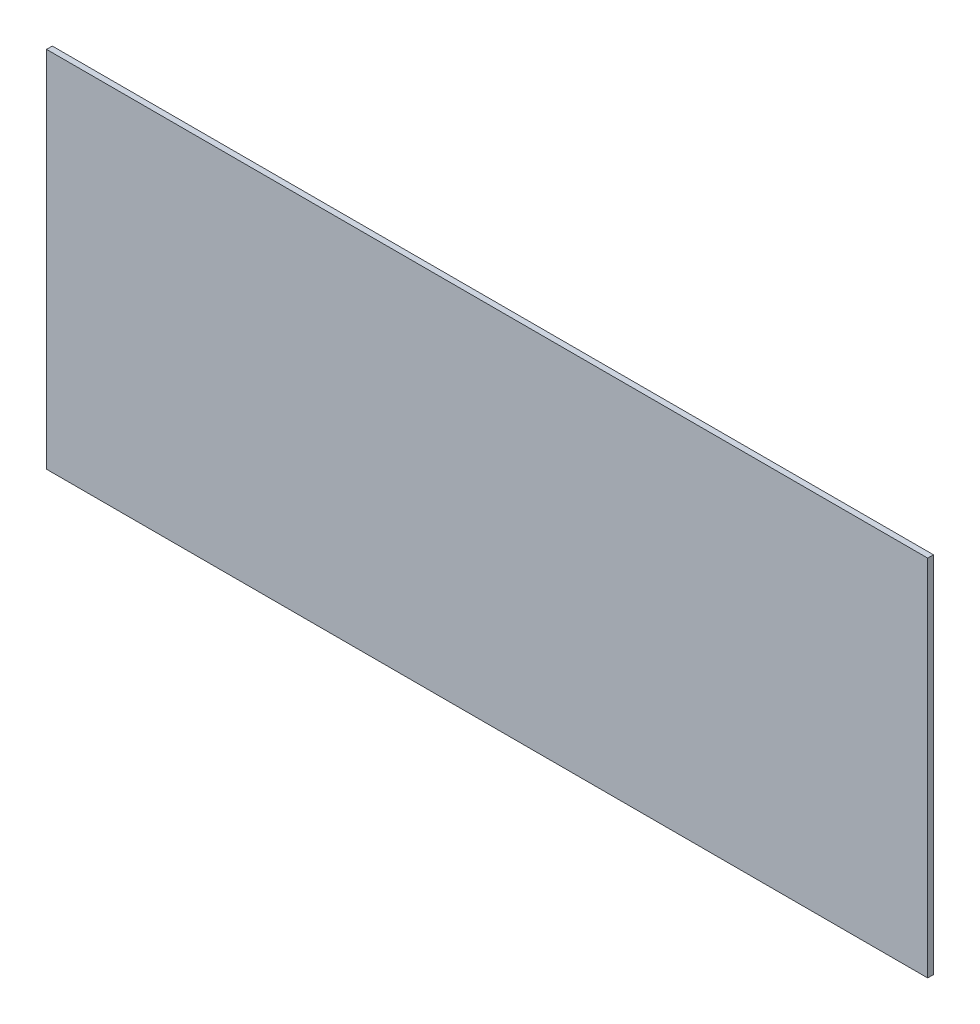
ISO-10303-21;
HEADER;
FILE_DESCRIPTION(('STEP AP214'),'2;1');
FILE_NAME('part.step','',(''),(''),'','','');
FILE_SCHEMA(('AUTOMOTIVE_DESIGN { 1 0 10303 214 1 1 1 1 }'));
ENDSEC;
DATA;
#1=APPLICATION_CONTEXT('core data for automotive mechanical design processes');
#2=APPLICATION_PROTOCOL_DEFINITION('international standard','automotive_design',2000,#1);
#3=PRODUCT_CONTEXT('',#1,'mechanical');
#4=PRODUCT('Part','Part','',(#3));
#5=PRODUCT_RELATED_PRODUCT_CATEGORY('part','',(#4));
#6=PRODUCT_DEFINITION_FORMATION('','',#4);
#7=PRODUCT_DEFINITION_CONTEXT('part definition',#1,'design');
#8=PRODUCT_DEFINITION('design','',#6,#7);
#9=PRODUCT_DEFINITION_SHAPE('','',#8);
#10=(LENGTH_UNIT() NAMED_UNIT(*) SI_UNIT(.MILLI.,.METRE.));
#11=(NAMED_UNIT(*) PLANE_ANGLE_UNIT() SI_UNIT($,.RADIAN.));
#12=(NAMED_UNIT(*) SI_UNIT($,.STERADIAN.) SOLID_ANGLE_UNIT());
#13=UNCERTAINTY_MEASURE_WITH_UNIT(LENGTH_MEASURE(1.E-05),#10,'distance_accuracy_value','');
#14=(GEOMETRIC_REPRESENTATION_CONTEXT(3) GLOBAL_UNCERTAINTY_ASSIGNED_CONTEXT((#13)) GLOBAL_UNIT_ASSIGNED_CONTEXT((#10,
#11,#12)) REPRESENTATION_CONTEXT('',''));
#15=CARTESIAN_POINT('',(0.,0.,0.));
#16=DIRECTION('',(0.,0.,1.));
#17=DIRECTION('',(1.,0.,0.));
#18=AXIS2_PLACEMENT_3D('',#15,#16,#17);
#19=CARTESIAN_POINT('',(-191.,-321.439024390244,2.));
#20=DIRECTION('',(-1.,0.,0.));
#21=DIRECTION('',(0.,0.,1.));
#22=AXIS2_PLACEMENT_3D('',#19,#20,#21);
#23=PLANE('',#22);
#24=DIRECTION('',(0.,1.,0.));
#25=VECTOR('',#24,1.);
#26=CARTESIAN_POINT('',(-191.,-321.439024390244,0.));
#27=LINE('',#26,#25);
#28=CARTESIAN_POINT('',(-191.,-321.439024390244,0.));
#29=VERTEX_POINT('',#28);
#30=CARTESIAN_POINT('',(-191.,-195.57921260815,0.));
#31=VERTEX_POINT('',#30);
#32=EDGE_CURVE('E69',#29,#31,#27,.T.);
#33=ORIENTED_EDGE('',*,*,#32,.F.);
#34=DIRECTION('',(0.,0.,-1.));
#35=VECTOR('',#34,1.);
#36=CARTESIAN_POINT('',(-191.,-321.439024390244,2.));
#37=LINE('',#36,#35);
#38=CARTESIAN_POINT('',(-191.,-321.439024390244,2.));
#39=VERTEX_POINT('',#38);
#40=EDGE_CURVE('E11',#39,#29,#37,.T.);
#41=ORIENTED_EDGE('',*,*,#40,.F.);
#42=DIRECTION('',(0.,1.,0.));
#43=VECTOR('',#42,1.);
#44=CARTESIAN_POINT('',(-191.,-321.439024390244,2.));
#45=LINE('',#44,#43);
#46=CARTESIAN_POINT('',(-191.,-195.57921260815,2.));
#47=VERTEX_POINT('',#46);
#48=EDGE_CURVE('E79',#39,#47,#45,.T.);
#49=ORIENTED_EDGE('',*,*,#48,.T.);
#50=DIRECTION('',(0.,0.,-1.));
#51=VECTOR('',#50,1.);
#52=CARTESIAN_POINT('',(-191.,-195.57921260815,0.));
#53=LINE('',#52,#51);
#54=EDGE_CURVE('E81',#47,#31,#53,.T.);
#55=ORIENTED_EDGE('',*,*,#54,.T.);
#56=EDGE_LOOP('',(#33,#41,#49,#55));
#57=FACE_BOUND('',#56,.T.);
#58=ADVANCED_FACE('F37',(#57),#23,.T.);
#59=CARTESIAN_POINT('',(114.,-321.439024390244,2.));
#60=DIRECTION('',(0.,-1.,0.));
#61=DIRECTION('',(0.,0.,-1.));
#62=AXIS2_PLACEMENT_3D('',#59,#60,#61);
#63=PLANE('',#62);
#64=DIRECTION('',(-1.,0.,0.));
#65=VECTOR('',#64,1.);
#66=CARTESIAN_POINT('',(114.,-321.439024390244,0.));
#67=LINE('',#66,#65);
#68=CARTESIAN_POINT('',(114.,-321.439024390244,0.));
#69=VERTEX_POINT('',#68);
#70=EDGE_CURVE('E107',#69,#29,#67,.T.);
#71=ORIENTED_EDGE('',*,*,#70,.F.);
#72=DIRECTION('',(0.,0.,-1.));
#73=VECTOR('',#72,1.);
#74=CARTESIAN_POINT('',(114.,-321.439024390244,2.));
#75=LINE('',#74,#73);
#76=CARTESIAN_POINT('',(114.,-321.439024390244,2.));
#77=VERTEX_POINT('',#76);
#78=EDGE_CURVE('E41',#77,#69,#75,.T.);
#79=ORIENTED_EDGE('',*,*,#78,.F.);
#80=DIRECTION('',(-1.,0.,0.));
#81=VECTOR('',#80,1.);
#82=CARTESIAN_POINT('',(114.,-321.439024390244,2.));
#83=LINE('',#82,#81);
#84=EDGE_CURVE('E85',#77,#39,#83,.T.);
#85=ORIENTED_EDGE('',*,*,#84,.T.);
#86=ORIENTED_EDGE('',*,*,#40,.T.);
#87=EDGE_LOOP('',(#71,#79,#85,#86));
#88=FACE_BOUND('',#87,.T.);
#89=ADVANCED_FACE('F111',(#88),#63,.T.);
#90=CARTESIAN_POINT('',(114.,-221.439024390244,2.));
#91=DIRECTION('',(1.,0.,0.));
#92=DIRECTION('',(0.,0.,-1.));
#93=AXIS2_PLACEMENT_3D('',#90,#91,#92);
#94=PLANE('',#93);
#95=DIRECTION('',(0.,-1.,0.));
#96=VECTOR('',#95,1.);
#97=CARTESIAN_POINT('',(114.,-221.439024390244,0.));
#98=LINE('',#97,#96);
#99=CARTESIAN_POINT('',(114.,-195.57921260815,0.));
#100=VERTEX_POINT('',#99);
#101=EDGE_CURVE('E104',#100,#69,#98,.T.);
#102=ORIENTED_EDGE('',*,*,#101,.F.);
#103=DIRECTION('',(0.,0.,1.));
#104=VECTOR('',#103,1.);
#105=CARTESIAN_POINT('',(114.,-195.57921260815,2.00000000000001));
#106=LINE('',#105,#104);
#107=CARTESIAN_POINT('',(114.,-195.57921260815,2.));
#108=VERTEX_POINT('',#107);
#109=EDGE_CURVE('E100',#100,#108,#106,.T.);
#110=ORIENTED_EDGE('',*,*,#109,.T.);
#111=DIRECTION('',(0.,-1.,0.));
#112=VECTOR('',#111,1.);
#113=CARTESIAN_POINT('',(114.,-221.439024390244,2.));
#114=LINE('',#113,#112);
#115=EDGE_CURVE('E96',#108,#77,#114,.T.);
#116=ORIENTED_EDGE('',*,*,#115,.T.);
#117=ORIENTED_EDGE('',*,*,#78,.T.);
#118=EDGE_LOOP('',(#102,#110,#116,#117));
#119=FACE_BOUND('',#118,.T.);
#120=ADVANCED_FACE('F39',(#119),#94,.T.);
#121=CARTESIAN_POINT('',(0.,0.,2.));
#122=DIRECTION('',(0.,0.,-1.));
#123=DIRECTION('',(-1.,0.,0.));
#124=AXIS2_PLACEMENT_3D('',#121,#122,#123);
#125=PLANE('',#124);
#126=ORIENTED_EDGE('',*,*,#115,.F.);
#127=DIRECTION('',(-1.,0.,0.));
#128=VECTOR('',#127,1.);
#129=CARTESIAN_POINT('',(-191.,-195.57921260815,2.));
#130=LINE('',#129,#128);
#131=EDGE_CURVE('E91',#108,#47,#130,.T.);
#132=ORIENTED_EDGE('',*,*,#131,.T.);
#133=ORIENTED_EDGE('',*,*,#48,.F.);
#134=ORIENTED_EDGE('',*,*,#84,.F.);
#135=EDGE_LOOP('',(#126,#132,#133,#134));
#136=FACE_BOUND('',#135,.T.);
#137=ADVANCED_FACE('F95',(#136),#125,.F.);
#138=CARTESIAN_POINT('',(0.,0.,0.));
#139=DIRECTION('',(0.,0.,-1.));
#140=DIRECTION('',(-1.,0.,0.));
#141=AXIS2_PLACEMENT_3D('',#138,#139,#140);
#142=PLANE('',#141);
#143=ORIENTED_EDGE('',*,*,#32,.T.);
#144=DIRECTION('',(1.,0.,0.));
#145=VECTOR('',#144,1.);
#146=CARTESIAN_POINT('',(114.,-195.57921260815,0.));
#147=LINE('',#146,#145);
#148=EDGE_CURVE('E93',#31,#100,#147,.T.);
#149=ORIENTED_EDGE('',*,*,#148,.T.);
#150=ORIENTED_EDGE('',*,*,#101,.T.);
#151=ORIENTED_EDGE('',*,*,#70,.T.);
#152=EDGE_LOOP('',(#143,#149,#150,#151));
#153=FACE_BOUND('',#152,.T.);
#154=ADVANCED_FACE('F109',(#153),#142,.T.);
#155=CARTESIAN_POINT('',(-38.5,-195.57921260815,-225.710638385712));
#156=DIRECTION('',(0.,-1.,0.));
#157=DIRECTION('',(0.,0.,1.));
#158=AXIS2_PLACEMENT_3D('',#155,#156,#157);
#159=PLANE('',#158);
#160=ORIENTED_EDGE('',*,*,#148,.F.);
#161=ORIENTED_EDGE('',*,*,#54,.F.);
#162=ORIENTED_EDGE('',*,*,#131,.F.);
#163=ORIENTED_EDGE('',*,*,#109,.F.);
#164=EDGE_LOOP('',(#160,#161,#162,#163));
#165=FACE_BOUND('',#164,.T.);
#166=ADVANCED_FACE('F89',(#165),#159,.F.);
#167=CLOSED_SHELL('',(#58,#89,#120,#137,#154,#166));
#168=MANIFOLD_SOLID_BREP('B2',#167);
#169=ADVANCED_BREP_SHAPE_REPRESENTATION('',(#18,#168),#14);
#170=SHAPE_DEFINITION_REPRESENTATION(#9,#169);
ENDSEC;
END-ISO-10303-21;
